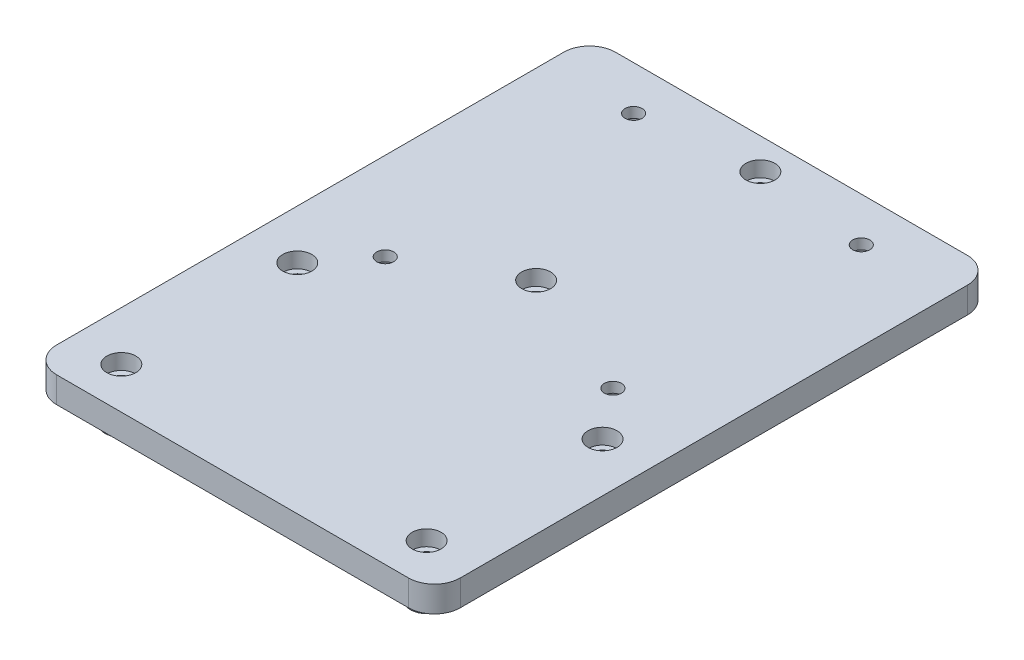
ISO-10303-21;
HEADER;
FILE_DESCRIPTION(('STEP AP214'),'2;1');
FILE_NAME('part.step','',(''),(''),'','','');
FILE_SCHEMA(('AUTOMOTIVE_DESIGN { 1 0 10303 214 1 1 1 1 }'));
ENDSEC;
DATA;
#1=APPLICATION_CONTEXT('core data for automotive mechanical design processes');
#2=APPLICATION_PROTOCOL_DEFINITION('international standard','automotive_design',2000,#1);
#3=PRODUCT_CONTEXT('',#1,'mechanical');
#4=PRODUCT('Part','Part','',(#3));
#5=PRODUCT_RELATED_PRODUCT_CATEGORY('part','',(#4));
#6=PRODUCT_DEFINITION_FORMATION('','',#4);
#7=PRODUCT_DEFINITION_CONTEXT('part definition',#1,'design');
#8=PRODUCT_DEFINITION('design','',#6,#7);
#9=PRODUCT_DEFINITION_SHAPE('','',#8);
#10=(LENGTH_UNIT() NAMED_UNIT(*) SI_UNIT(.MILLI.,.METRE.));
#11=(NAMED_UNIT(*) PLANE_ANGLE_UNIT() SI_UNIT($,.RADIAN.));
#12=(NAMED_UNIT(*) SI_UNIT($,.STERADIAN.) SOLID_ANGLE_UNIT());
#13=UNCERTAINTY_MEASURE_WITH_UNIT(LENGTH_MEASURE(1.E-05),#10,'distance_accuracy_value','');
#14=(GEOMETRIC_REPRESENTATION_CONTEXT(3) GLOBAL_UNCERTAINTY_ASSIGNED_CONTEXT((#13)) GLOBAL_UNIT_ASSIGNED_CONTEXT((#10,
#11,#12)) REPRESENTATION_CONTEXT('',''));
#15=CARTESIAN_POINT('',(0.,0.,0.));
#16=DIRECTION('',(0.,0.,1.));
#17=DIRECTION('',(1.,0.,0.));
#18=AXIS2_PLACEMENT_3D('',#15,#16,#17);
#19=CARTESIAN_POINT('',(0.,0.00200000000000027,-43.));
#20=DIRECTION('',(0.,-1.,0.));
#21=DIRECTION('',(0.,0.,-1.));
#22=AXIS2_PLACEMENT_3D('',#19,#20,#21);
#23=CYLINDRICAL_SURFACE('',#22,1.65);
#24=CARTESIAN_POINT('',(0.,-5.,-43.));
#25=DIRECTION('',(0.,-1.,0.));
#26=DIRECTION('',(0.,0.,-1.));
#27=AXIS2_PLACEMENT_3D('',#24,#25,#26);
#28=CIRCLE('',#27,1.65);
#29=CARTESIAN_POINT('',(0.,-5.,-44.65));
#30=VERTEX_POINT('',#29);
#31=EDGE_CURVE('E213',#30,#30,#28,.T.);
#32=ORIENTED_EDGE('',*,*,#31,.T.);
#33=EDGE_LOOP('',(#32));
#34=FACE_BOUND('',#33,.T.);
#35=CARTESIAN_POINT('',(0.,-3.,-43.));
#36=DIRECTION('',(0.,-1.,0.));
#37=DIRECTION('',(0.,0.,-1.));
#38=AXIS2_PLACEMENT_3D('',#35,#36,#37);
#39=CIRCLE('',#38,1.65);
#40=CARTESIAN_POINT('',(0.,-3.,-44.65));
#41=VERTEX_POINT('',#40);
#42=EDGE_CURVE('E655',#41,#41,#39,.F.);
#43=ORIENTED_EDGE('',*,*,#42,.T.);
#44=EDGE_LOOP('',(#43));
#45=FACE_BOUND('',#44,.T.);
#46=ADVANCED_FACE('F16',(#34,#45),#23,.F.);
#47=CARTESIAN_POINT('',(-3.48622970990632,0.00200000000000027,-3.15221207633018));
#48=DIRECTION('',(0.,-1.,0.));
#49=DIRECTION('',(0.,0.,-1.));
#50=AXIS2_PLACEMENT_3D('',#47,#48,#49);
#51=CYLINDRICAL_SURFACE('',#50,1.65);
#52=CARTESIAN_POINT('',(-3.48622970990632,-5.,-3.15221207633018));
#53=DIRECTION('',(0.,-1.,0.));
#54=DIRECTION('',(0.,0.,-1.));
#55=AXIS2_PLACEMENT_3D('',#52,#53,#54);
#56=CIRCLE('',#55,1.65);
#57=CARTESIAN_POINT('',(-3.48622970990632,-5.,-4.80221207633017));
#58=VERTEX_POINT('',#57);
#59=EDGE_CURVE('E220',#58,#58,#56,.T.);
#60=ORIENTED_EDGE('',*,*,#59,.T.);
#61=EDGE_LOOP('',(#60));
#62=FACE_BOUND('',#61,.T.);
#63=CARTESIAN_POINT('',(-3.48622970990632,-3.,-3.15221207633018));
#64=DIRECTION('',(0.,-1.,0.));
#65=DIRECTION('',(0.,0.,-1.));
#66=AXIS2_PLACEMENT_3D('',#63,#64,#65);
#67=CIRCLE('',#66,1.65);
#68=CARTESIAN_POINT('',(-3.48622970990632,-3.,-4.80221207633017));
#69=VERTEX_POINT('',#68);
#70=EDGE_CURVE('E274',#69,#69,#67,.F.);
#71=ORIENTED_EDGE('',*,*,#70,.T.);
#72=EDGE_LOOP('',(#71));
#73=FACE_BOUND('',#72,.T.);
#74=ADVANCED_FACE('F368',(#62,#73),#51,.F.);
#75=CARTESIAN_POINT('',(-29.5,-10.,17.));
#76=DIRECTION('',(0.,1.,0.));
#77=DIRECTION('',(0.,0.,1.));
#78=AXIS2_PLACEMENT_3D('',#75,#76,#77);
#79=CYLINDRICAL_SURFACE('',#78,1.65);
#80=CARTESIAN_POINT('',(-29.5,-10.,17.));
#81=DIRECTION('',(0.,-1.,0.));
#82=DIRECTION('',(0.,0.,-1.));
#83=AXIS2_PLACEMENT_3D('',#80,#81,#82);
#84=CIRCLE('',#83,1.65);
#85=CARTESIAN_POINT('',(-29.5,-10.,15.35));
#86=VERTEX_POINT('',#85);
#87=EDGE_CURVE('E320',#86,#86,#84,.T.);
#88=ORIENTED_EDGE('',*,*,#87,.T.);
#89=EDGE_LOOP('',(#88));
#90=FACE_BOUND('',#89,.T.);
#91=CARTESIAN_POINT('',(-29.5,-3.,17.));
#92=DIRECTION('',(0.,-1.,0.));
#93=DIRECTION('',(0.,0.,-1.));
#94=AXIS2_PLACEMENT_3D('',#91,#92,#93);
#95=CIRCLE('',#94,1.65);
#96=CARTESIAN_POINT('',(-29.5,-3.,15.35));
#97=VERTEX_POINT('',#96);
#98=EDGE_CURVE('E648',#97,#97,#95,.F.);
#99=ORIENTED_EDGE('',*,*,#98,.T.);
#100=EDGE_LOOP('',(#99));
#101=FACE_BOUND('',#100,.T.);
#102=ADVANCED_FACE('F374',(#90,#101),#79,.F.);
#103=CARTESIAN_POINT('',(-29.5,-10.,51.));
#104=DIRECTION('',(0.,1.,0.));
#105=DIRECTION('',(0.,0.,1.));
#106=AXIS2_PLACEMENT_3D('',#103,#104,#105);
#107=CYLINDRICAL_SURFACE('',#106,1.65);
#108=CARTESIAN_POINT('',(-29.5,-10.,51.));
#109=DIRECTION('',(0.,-1.,0.));
#110=DIRECTION('',(0.,0.,-1.));
#111=AXIS2_PLACEMENT_3D('',#108,#109,#110);
#112=CIRCLE('',#111,1.65);
#113=CARTESIAN_POINT('',(-29.5,-10.,49.35));
#114=VERTEX_POINT('',#113);
#115=EDGE_CURVE('E316',#114,#114,#112,.T.);
#116=ORIENTED_EDGE('',*,*,#115,.T.);
#117=EDGE_LOOP('',(#116));
#118=FACE_BOUND('',#117,.T.);
#119=CARTESIAN_POINT('',(-29.5,-3.,51.));
#120=DIRECTION('',(0.,-1.,0.));
#121=DIRECTION('',(0.,0.,-1.));
#122=AXIS2_PLACEMENT_3D('',#119,#120,#121);
#123=CIRCLE('',#122,1.65);
#124=CARTESIAN_POINT('',(-29.5,-3.,49.35));
#125=VERTEX_POINT('',#124);
#126=EDGE_CURVE('E641',#125,#125,#123,.T.);
#127=ORIENTED_EDGE('',*,*,#126,.F.);
#128=EDGE_LOOP('',(#127));
#129=FACE_BOUND('',#128,.T.);
#130=ADVANCED_FACE('F488',(#118,#129),#107,.F.);
#131=CARTESIAN_POINT('',(29.5,-10.,51.));
#132=DIRECTION('',(0.,1.,0.));
#133=DIRECTION('',(0.,0.,1.));
#134=AXIS2_PLACEMENT_3D('',#131,#132,#133);
#135=CYLINDRICAL_SURFACE('',#134,1.65);
#136=CARTESIAN_POINT('',(29.5,-10.,51.));
#137=DIRECTION('',(0.,-1.,0.));
#138=DIRECTION('',(0.,0.,-1.));
#139=AXIS2_PLACEMENT_3D('',#136,#137,#138);
#140=CIRCLE('',#139,1.65);
#141=CARTESIAN_POINT('',(29.5,-10.,49.35));
#142=VERTEX_POINT('',#141);
#143=EDGE_CURVE('E304',#142,#142,#140,.T.);
#144=ORIENTED_EDGE('',*,*,#143,.T.);
#145=EDGE_LOOP('',(#144));
#146=FACE_BOUND('',#145,.T.);
#147=CARTESIAN_POINT('',(29.5,-3.,51.));
#148=DIRECTION('',(0.,-1.,0.));
#149=DIRECTION('',(0.,0.,-1.));
#150=AXIS2_PLACEMENT_3D('',#147,#148,#149);
#151=CIRCLE('',#150,1.65);
#152=CARTESIAN_POINT('',(29.5,-3.,49.35));
#153=VERTEX_POINT('',#152);
#154=EDGE_CURVE('E634',#153,#153,#151,.T.);
#155=ORIENTED_EDGE('',*,*,#154,.F.);
#156=EDGE_LOOP('',(#155));
#157=FACE_BOUND('',#156,.T.);
#158=ADVANCED_FACE('F476',(#146,#157),#135,.F.);
#159=CARTESIAN_POINT('',(29.5,-10.,17.));
#160=DIRECTION('',(0.,1.,0.));
#161=DIRECTION('',(0.,0.,1.));
#162=AXIS2_PLACEMENT_3D('',#159,#160,#161);
#163=CYLINDRICAL_SURFACE('',#162,1.65);
#164=CARTESIAN_POINT('',(29.5,-10.,17.));
#165=DIRECTION('',(0.,-1.,0.));
#166=DIRECTION('',(0.,0.,-1.));
#167=AXIS2_PLACEMENT_3D('',#164,#165,#166);
#168=CIRCLE('',#167,1.65);
#169=CARTESIAN_POINT('',(29.5,-10.,15.35));
#170=VERTEX_POINT('',#169);
#171=EDGE_CURVE('E292',#170,#170,#168,.T.);
#172=ORIENTED_EDGE('',*,*,#171,.T.);
#173=EDGE_LOOP('',(#172));
#174=FACE_BOUND('',#173,.T.);
#175=CARTESIAN_POINT('',(29.5,-3.,17.));
#176=DIRECTION('',(0.,-1.,0.));
#177=DIRECTION('',(0.,0.,-1.));
#178=AXIS2_PLACEMENT_3D('',#175,#176,#177);
#179=CIRCLE('',#178,1.65);
#180=CARTESIAN_POINT('',(29.5,-3.,15.35));
#181=VERTEX_POINT('',#180);
#182=EDGE_CURVE('E627',#181,#181,#179,.T.);
#183=ORIENTED_EDGE('',*,*,#182,.F.);
#184=EDGE_LOOP('',(#183));
#185=FACE_BOUND('',#184,.T.);
#186=ADVANCED_FACE('F391',(#174,#185),#163,.F.);
#187=CARTESIAN_POINT('',(-22.,-5.,7.5));
#188=DIRECTION('',(0.,1.,0.));
#189=DIRECTION('',(0.,0.,1.));
#190=AXIS2_PLACEMENT_3D('',#187,#188,#189);
#191=CYLINDRICAL_SURFACE('',#190,1.65);
#192=CARTESIAN_POINT('',(-22.,0.,7.5));
#193=DIRECTION('',(0.,-1.,0.));
#194=DIRECTION('',(0.,0.,-1.));
#195=AXIS2_PLACEMENT_3D('',#192,#193,#194);
#196=CIRCLE('',#195,1.65);
#197=CARTESIAN_POINT('',(-22.,0.,5.85));
#198=VERTEX_POINT('',#197);
#199=EDGE_CURVE('E135',#198,#198,#196,.T.);
#200=ORIENTED_EDGE('',*,*,#199,.F.);
#201=EDGE_LOOP('',(#200));
#202=FACE_BOUND('',#201,.T.);
#203=CARTESIAN_POINT('',(-22.,-2.,7.5));
#204=DIRECTION('',(0.,-1.,0.));
#205=DIRECTION('',(0.,0.,-1.));
#206=AXIS2_PLACEMENT_3D('',#203,#204,#205);
#207=CIRCLE('',#206,1.65);
#208=CARTESIAN_POINT('',(-22.,-2.,5.85));
#209=VERTEX_POINT('',#208);
#210=EDGE_CURVE('E279',#209,#209,#207,.T.);
#211=ORIENTED_EDGE('',*,*,#210,.T.);
#212=EDGE_LOOP('',(#211));
#213=FACE_BOUND('',#212,.T.);
#214=ADVANCED_FACE('F249',(#202,#213),#191,.F.);
#215=CARTESIAN_POINT('',(-22.,-5.,-40.5));
#216=DIRECTION('',(0.,1.,0.));
#217=DIRECTION('',(0.,0.,1.));
#218=AXIS2_PLACEMENT_3D('',#215,#216,#217);
#219=CYLINDRICAL_SURFACE('',#218,1.65);
#220=CARTESIAN_POINT('',(-22.,0.,-40.5));
#221=DIRECTION('',(0.,-1.,0.));
#222=DIRECTION('',(0.,0.,-1.));
#223=AXIS2_PLACEMENT_3D('',#220,#221,#222);
#224=CIRCLE('',#223,1.65);
#225=CARTESIAN_POINT('',(-22.,0.,-42.15));
#226=VERTEX_POINT('',#225);
#227=EDGE_CURVE('E145',#226,#226,#224,.T.);
#228=ORIENTED_EDGE('',*,*,#227,.F.);
#229=EDGE_LOOP('',(#228));
#230=FACE_BOUND('',#229,.T.);
#231=CARTESIAN_POINT('',(-22.,-2.,-40.5));
#232=DIRECTION('',(0.,-1.,0.));
#233=DIRECTION('',(0.,0.,-1.));
#234=AXIS2_PLACEMENT_3D('',#231,#232,#233);
#235=CIRCLE('',#234,1.65);
#236=CARTESIAN_POINT('',(-22.,-2.,-42.15));
#237=VERTEX_POINT('',#236);
#238=EDGE_CURVE('E253',#237,#237,#235,.T.);
#239=ORIENTED_EDGE('',*,*,#238,.T.);
#240=EDGE_LOOP('',(#239));
#241=FACE_BOUND('',#240,.T.);
#242=ADVANCED_FACE('F245',(#230,#241),#219,.F.);
#243=CARTESIAN_POINT('',(22.,-5.,-40.5));
#244=DIRECTION('',(0.,1.,0.));
#245=DIRECTION('',(0.,0.,1.));
#246=AXIS2_PLACEMENT_3D('',#243,#244,#245);
#247=CYLINDRICAL_SURFACE('',#246,1.65);
#248=CARTESIAN_POINT('',(22.,0.,-40.5));
#249=DIRECTION('',(0.,-1.,0.));
#250=DIRECTION('',(0.,0.,-1.));
#251=AXIS2_PLACEMENT_3D('',#248,#249,#250);
#252=CIRCLE('',#251,1.65);
#253=CARTESIAN_POINT('',(22.,0.,-42.15));
#254=VERTEX_POINT('',#253);
#255=EDGE_CURVE('E235',#254,#254,#252,.T.);
#256=ORIENTED_EDGE('',*,*,#255,.F.);
#257=EDGE_LOOP('',(#256));
#258=FACE_BOUND('',#257,.T.);
#259=CARTESIAN_POINT('',(22.,-2.,-40.5));
#260=DIRECTION('',(0.,-1.,0.));
#261=DIRECTION('',(0.,0.,-1.));
#262=AXIS2_PLACEMENT_3D('',#259,#260,#261);
#263=CIRCLE('',#262,1.65);
#264=CARTESIAN_POINT('',(22.,-2.,-42.15));
#265=VERTEX_POINT('',#264);
#266=EDGE_CURVE('E775',#265,#265,#263,.T.);
#267=ORIENTED_EDGE('',*,*,#266,.T.);
#268=EDGE_LOOP('',(#267));
#269=FACE_BOUND('',#268,.T.);
#270=ADVANCED_FACE('F248',(#258,#269),#247,.F.);
#271=CARTESIAN_POINT('',(22.,-5.,7.5));
#272=DIRECTION('',(0.,1.,0.));
#273=DIRECTION('',(0.,0.,1.));
#274=AXIS2_PLACEMENT_3D('',#271,#272,#273);
#275=CYLINDRICAL_SURFACE('',#274,1.65);
#276=CARTESIAN_POINT('',(22.,0.,7.5));
#277=DIRECTION('',(0.,-1.,0.));
#278=DIRECTION('',(0.,0.,-1.));
#279=AXIS2_PLACEMENT_3D('',#276,#277,#278);
#280=CIRCLE('',#279,1.65);
#281=CARTESIAN_POINT('',(22.,0.,5.85));
#282=VERTEX_POINT('',#281);
#283=EDGE_CURVE('E226',#282,#282,#280,.T.);
#284=ORIENTED_EDGE('',*,*,#283,.F.);
#285=EDGE_LOOP('',(#284));
#286=FACE_BOUND('',#285,.T.);
#287=CARTESIAN_POINT('',(22.,-2.,7.5));
#288=DIRECTION('',(0.,-1.,0.));
#289=DIRECTION('',(0.,0.,-1.));
#290=AXIS2_PLACEMENT_3D('',#287,#288,#289);
#291=CIRCLE('',#290,1.65);
#292=CARTESIAN_POINT('',(22.,-2.,5.85));
#293=VERTEX_POINT('',#292);
#294=EDGE_CURVE('E765',#293,#293,#291,.T.);
#295=ORIENTED_EDGE('',*,*,#294,.T.);
#296=EDGE_LOOP('',(#295));
#297=FACE_BOUND('',#296,.T.);
#298=ADVANCED_FACE('F382',(#286,#297),#275,.F.);
#299=CARTESIAN_POINT('',(0.,0.,0.));
#300=DIRECTION('',(0.,-1.,0.));
#301=DIRECTION('',(1.,0.,0.));
#302=AXIS2_PLACEMENT_3D('',#299,#300,#301);
#303=PLANE('',#302);
#304=CARTESIAN_POINT('',(-29.5,0.,51.));
#305=DIRECTION('',(0.,1.,0.));
#306=DIRECTION('',(0.,0.,1.));
#307=AXIS2_PLACEMENT_3D('',#304,#305,#306);
#308=CIRCLE('',#307,2.8);
#309=CARTESIAN_POINT('',(-29.5,0.,53.8));
#310=VERTEX_POINT('',#309);
#311=EDGE_CURVE('E652',#310,#310,#308,.T.);
#312=ORIENTED_EDGE('',*,*,#311,.F.);
#313=EDGE_LOOP('',(#312));
#314=FACE_BOUND('',#313,.T.);
#315=CARTESIAN_POINT('',(29.5,0.,17.));
#316=DIRECTION('',(0.,1.,0.));
#317=DIRECTION('',(0.,0.,1.));
#318=AXIS2_PLACEMENT_3D('',#315,#316,#317);
#319=CIRCLE('',#318,2.8);
#320=CARTESIAN_POINT('',(29.5,0.,19.8));
#321=VERTEX_POINT('',#320);
#322=EDGE_CURVE('E645',#321,#321,#319,.T.);
#323=ORIENTED_EDGE('',*,*,#322,.F.);
#324=EDGE_LOOP('',(#323));
#325=FACE_BOUND('',#324,.T.);
#326=CARTESIAN_POINT('',(29.5,0.,51.));
#327=DIRECTION('',(0.,1.,0.));
#328=DIRECTION('',(0.,0.,1.));
#329=AXIS2_PLACEMENT_3D('',#326,#327,#328);
#330=CIRCLE('',#329,2.8);
#331=CARTESIAN_POINT('',(29.5,0.,53.8));
#332=VERTEX_POINT('',#331);
#333=EDGE_CURVE('E631',#332,#332,#330,.T.);
#334=ORIENTED_EDGE('',*,*,#333,.F.);
#335=EDGE_LOOP('',(#334));
#336=FACE_BOUND('',#335,.T.);
#337=CARTESIAN_POINT('',(0.,0.,-43.));
#338=DIRECTION('',(0.,1.,0.));
#339=DIRECTION('',(0.,0.,1.));
#340=AXIS2_PLACEMENT_3D('',#337,#338,#339);
#341=CIRCLE('',#340,2.8);
#342=CARTESIAN_POINT('',(0.,0.,-40.2));
#343=VERTEX_POINT('',#342);
#344=EDGE_CURVE('E638',#343,#343,#341,.T.);
#345=ORIENTED_EDGE('',*,*,#344,.F.);
#346=EDGE_LOOP('',(#345));
#347=FACE_BOUND('',#346,.T.);
#348=CARTESIAN_POINT('',(-29.5,0.,17.));
#349=DIRECTION('',(0.,1.,0.));
#350=DIRECTION('',(0.,0.,1.));
#351=AXIS2_PLACEMENT_3D('',#348,#349,#350);
#352=CIRCLE('',#351,2.8);
#353=CARTESIAN_POINT('',(-29.5,0.,19.8));
#354=VERTEX_POINT('',#353);
#355=EDGE_CURVE('E669',#354,#354,#352,.T.);
#356=ORIENTED_EDGE('',*,*,#355,.F.);
#357=EDGE_LOOP('',(#356));
#358=FACE_BOUND('',#357,.T.);
#359=CARTESIAN_POINT('',(-3.48622970990632,0.,-3.15221207633018));
#360=DIRECTION('',(0.,1.,0.));
#361=DIRECTION('',(0.,0.,1.));
#362=AXIS2_PLACEMENT_3D('',#359,#360,#361);
#363=CIRCLE('',#362,2.8);
#364=CARTESIAN_POINT('',(-3.48622970990632,0.,-0.352212076330175));
#365=VERTEX_POINT('',#364);
#366=EDGE_CURVE('E702',#365,#365,#363,.T.);
#367=ORIENTED_EDGE('',*,*,#366,.F.);
#368=EDGE_LOOP('',(#367));
#369=FACE_BOUND('',#368,.T.);
#370=DIRECTION('',(0.,0.,-1.));
#371=VECTOR('',#370,1.);
#372=CARTESIAN_POINT('',(-39.,0.,0.));
#373=LINE('',#372,#371);
#374=CARTESIAN_POINT('',(-39.,0.,54.));
#375=VERTEX_POINT('',#374);
#376=CARTESIAN_POINT('',(-39.,0.,-44.));
#377=VERTEX_POINT('',#376);
#378=EDGE_CURVE('E122',#375,#377,#373,.T.);
#379=ORIENTED_EDGE('',*,*,#378,.F.);
#380=CARTESIAN_POINT('',(-34.,0.,54.));
#381=DIRECTION('',(0.,-1.,0.));
#382=DIRECTION('',(0.,0.,-1.));
#383=AXIS2_PLACEMENT_3D('',#380,#381,#382);
#384=CIRCLE('',#383,5.);
#385=CARTESIAN_POINT('',(-34.,0.,59.));
#386=VERTEX_POINT('',#385);
#387=EDGE_CURVE('E104',#375,#386,#384,.F.);
#388=ORIENTED_EDGE('',*,*,#387,.T.);
#389=DIRECTION('',(1.,0.,0.));
#390=VECTOR('',#389,1.);
#391=CARTESIAN_POINT('',(0.,0.,59.));
#392=LINE('',#391,#390);
#393=CARTESIAN_POINT('',(34.,0.,59.));
#394=VERTEX_POINT('',#393);
#395=EDGE_CURVE('E206',#386,#394,#392,.T.);
#396=ORIENTED_EDGE('',*,*,#395,.T.);
#397=CARTESIAN_POINT('',(34.,0.,54.));
#398=DIRECTION('',(0.,-1.,0.));
#399=DIRECTION('',(0.,0.,-1.));
#400=AXIS2_PLACEMENT_3D('',#397,#398,#399);
#401=CIRCLE('',#400,5.);
#402=CARTESIAN_POINT('',(39.,0.,54.));
#403=VERTEX_POINT('',#402);
#404=EDGE_CURVE('E116',#394,#403,#401,.F.);
#405=ORIENTED_EDGE('',*,*,#404,.T.);
#406=DIRECTION('',(0.,0.,-1.));
#407=VECTOR('',#406,1.);
#408=CARTESIAN_POINT('',(39.,0.,0.));
#409=LINE('',#408,#407);
#410=CARTESIAN_POINT('',(39.,0.,-44.));
#411=VERTEX_POINT('',#410);
#412=EDGE_CURVE('E141',#403,#411,#409,.T.);
#413=ORIENTED_EDGE('',*,*,#412,.T.);
#414=CARTESIAN_POINT('',(34.,0.,-44.));
#415=DIRECTION('',(0.,-1.,0.));
#416=DIRECTION('',(0.,0.,-1.));
#417=AXIS2_PLACEMENT_3D('',#414,#415,#416);
#418=CIRCLE('',#417,5.);
#419=CARTESIAN_POINT('',(34.,0.,-49.));
#420=VERTEX_POINT('',#419);
#421=EDGE_CURVE('E126',#411,#420,#418,.F.);
#422=ORIENTED_EDGE('',*,*,#421,.T.);
#423=DIRECTION('',(1.,0.,0.));
#424=VECTOR('',#423,1.);
#425=CARTESIAN_POINT('',(0.,0.,-49.));
#426=LINE('',#425,#424);
#427=CARTESIAN_POINT('',(-34.,0.,-49.));
#428=VERTEX_POINT('',#427);
#429=EDGE_CURVE('E134',#428,#420,#426,.T.);
#430=ORIENTED_EDGE('',*,*,#429,.F.);
#431=CARTESIAN_POINT('',(-34.,0.,-44.));
#432=DIRECTION('',(0.,-1.,0.));
#433=DIRECTION('',(0.,0.,-1.));
#434=AXIS2_PLACEMENT_3D('',#431,#432,#433);
#435=CIRCLE('',#434,5.);
#436=EDGE_CURVE('E132',#428,#377,#435,.F.);
#437=ORIENTED_EDGE('',*,*,#436,.T.);
#438=EDGE_LOOP('',(#379,#388,#396,#405,#413,#422,#430,#437));
#439=FACE_BOUND('',#438,.T.);
#440=ORIENTED_EDGE('',*,*,#199,.T.);
#441=EDGE_LOOP('',(#440));
#442=FACE_BOUND('',#441,.T.);
#443=ORIENTED_EDGE('',*,*,#227,.T.);
#444=EDGE_LOOP('',(#443));
#445=FACE_BOUND('',#444,.T.);
#446=ORIENTED_EDGE('',*,*,#255,.T.);
#447=EDGE_LOOP('',(#446));
#448=FACE_BOUND('',#447,.T.);
#449=ORIENTED_EDGE('',*,*,#283,.T.);
#450=EDGE_LOOP('',(#449));
#451=FACE_BOUND('',#450,.T.);
#452=ADVANCED_FACE('F129',(#314,#325,#336,#347,#358,#369,#439,#442,#445,#448,#451),#303,.F.);
#453=CARTESIAN_POINT('',(-39.,-5.,0.));
#454=DIRECTION('',(1.,0.,0.));
#455=DIRECTION('',(0.,0.,-1.));
#456=AXIS2_PLACEMENT_3D('',#453,#454,#455);
#457=PLANE('',#456);
#458=DIRECTION('',(0.,0.,-1.));
#459=VECTOR('',#458,1.);
#460=CARTESIAN_POINT('',(-39.,-5.,0.));
#461=LINE('',#460,#459);
#462=CARTESIAN_POINT('',(-39.,-5.,54.));
#463=VERTEX_POINT('',#462);
#464=CARTESIAN_POINT('',(-39.,-5.,-44.));
#465=VERTEX_POINT('',#464);
#466=EDGE_CURVE('E124',#463,#465,#461,.T.);
#467=ORIENTED_EDGE('',*,*,#466,.F.);
#468=DIRECTION('',(0.,1.,0.));
#469=VECTOR('',#468,1.);
#470=CARTESIAN_POINT('',(-39.,0.,54.));
#471=LINE('',#470,#469);
#472=EDGE_CURVE('E108',#463,#375,#471,.T.);
#473=ORIENTED_EDGE('',*,*,#472,.T.);
#474=ORIENTED_EDGE('',*,*,#378,.T.);
#475=DIRECTION('',(0.,1.,0.));
#476=VECTOR('',#475,1.);
#477=CARTESIAN_POINT('',(-39.,-5.,-44.));
#478=LINE('',#477,#476);
#479=EDGE_CURVE('E127',#377,#465,#478,.F.);
#480=ORIENTED_EDGE('',*,*,#479,.T.);
#481=EDGE_LOOP('',(#467,#473,#474,#480));
#482=FACE_BOUND('',#481,.T.);
#483=ADVANCED_FACE('F121',(#482),#457,.F.);
#484=CARTESIAN_POINT('',(0.,-5.,-49.));
#485=DIRECTION('',(0.,0.,1.));
#486=DIRECTION('',(1.,0.,0.));
#487=AXIS2_PLACEMENT_3D('',#484,#485,#486);
#488=PLANE('',#487);
#489=DIRECTION('',(1.,0.,0.));
#490=VECTOR('',#489,1.);
#491=CARTESIAN_POINT('',(0.,-5.,-49.));
#492=LINE('',#491,#490);
#493=CARTESIAN_POINT('',(-34.,-5.,-49.));
#494=VERTEX_POINT('',#493);
#495=CARTESIAN_POINT('',(34.,-5.,-49.));
#496=VERTEX_POINT('',#495);
#497=EDGE_CURVE('E193',#494,#496,#492,.T.);
#498=ORIENTED_EDGE('',*,*,#497,.F.);
#499=DIRECTION('',(0.,1.,0.));
#500=VECTOR('',#499,1.);
#501=CARTESIAN_POINT('',(-34.,-5.,-49.));
#502=LINE('',#501,#500);
#503=EDGE_CURVE('E10',#494,#428,#502,.T.);
#504=ORIENTED_EDGE('',*,*,#503,.T.);
#505=ORIENTED_EDGE('',*,*,#429,.T.);
#506=DIRECTION('',(0.,1.,0.));
#507=VECTOR('',#506,1.);
#508=CARTESIAN_POINT('',(34.,-5.,-49.));
#509=LINE('',#508,#507);
#510=EDGE_CURVE('E25',#420,#496,#509,.F.);
#511=ORIENTED_EDGE('',*,*,#510,.T.);
#512=EDGE_LOOP('',(#498,#504,#505,#511));
#513=FACE_BOUND('',#512,.T.);
#514=ADVANCED_FACE('F356',(#513),#488,.F.);
#515=CARTESIAN_POINT('',(39.,-5.,0.));
#516=DIRECTION('',(1.,0.,0.));
#517=DIRECTION('',(0.,0.,-1.));
#518=AXIS2_PLACEMENT_3D('',#515,#516,#517);
#519=PLANE('',#518);
#520=ORIENTED_EDGE('',*,*,#412,.F.);
#521=DIRECTION('',(0.,1.,0.));
#522=VECTOR('',#521,1.);
#523=CARTESIAN_POINT('',(39.,-5.,54.));
#524=LINE('',#523,#522);
#525=CARTESIAN_POINT('',(39.,-5.,54.));
#526=VERTEX_POINT('',#525);
#527=EDGE_CURVE('E181',#403,#526,#524,.F.);
#528=ORIENTED_EDGE('',*,*,#527,.T.);
#529=DIRECTION('',(0.,0.,-1.));
#530=VECTOR('',#529,1.);
#531=CARTESIAN_POINT('',(39.,-5.,0.));
#532=LINE('',#531,#530);
#533=CARTESIAN_POINT('',(39.,-5.,-44.));
#534=VERTEX_POINT('',#533);
#535=EDGE_CURVE('E195',#526,#534,#532,.T.);
#536=ORIENTED_EDGE('',*,*,#535,.T.);
#537=DIRECTION('',(0.,1.,0.));
#538=VECTOR('',#537,1.);
#539=CARTESIAN_POINT('',(39.,0.,-44.));
#540=LINE('',#539,#538);
#541=EDGE_CURVE('E177',#534,#411,#540,.T.);
#542=ORIENTED_EDGE('',*,*,#541,.T.);
#543=EDGE_LOOP('',(#520,#528,#536,#542));
#544=FACE_BOUND('',#543,.T.);
#545=ADVANCED_FACE('F340',(#544),#519,.T.);
#546=CARTESIAN_POINT('',(0.,-5.,0.));
#547=DIRECTION('',(0.,-1.,0.));
#548=DIRECTION('',(1.,0.,0.));
#549=AXIS2_PLACEMENT_3D('',#546,#547,#548);
#550=PLANE('',#549);
#551=CARTESIAN_POINT('',(-22.,-5.,-40.5));
#552=DIRECTION('',(0.,-1.,0.));
#553=DIRECTION('',(0.,0.,-1.));
#554=AXIS2_PLACEMENT_3D('',#551,#552,#553);
#555=CIRCLE('',#554,2.8);
#556=CARTESIAN_POINT('',(-22.,-5.,-43.3));
#557=VERTEX_POINT('',#556);
#558=EDGE_CURVE('E268',#557,#557,#555,.T.);
#559=ORIENTED_EDGE('',*,*,#558,.F.);
#560=EDGE_LOOP('',(#559));
#561=FACE_BOUND('',#560,.T.);
#562=CARTESIAN_POINT('',(22.,-5.,-40.5));
#563=DIRECTION('',(0.,-1.,0.));
#564=DIRECTION('',(0.,0.,-1.));
#565=AXIS2_PLACEMENT_3D('',#562,#563,#564);
#566=CIRCLE('',#565,2.8);
#567=CARTESIAN_POINT('',(22.,-5.,-43.3));
#568=VERTEX_POINT('',#567);
#569=EDGE_CURVE('E256',#568,#568,#566,.T.);
#570=ORIENTED_EDGE('',*,*,#569,.F.);
#571=EDGE_LOOP('',(#570));
#572=FACE_BOUND('',#571,.T.);
#573=CARTESIAN_POINT('',(22.,-5.,7.5));
#574=DIRECTION('',(0.,-1.,0.));
#575=DIRECTION('',(0.,0.,-1.));
#576=AXIS2_PLACEMENT_3D('',#573,#574,#575);
#577=CIRCLE('',#576,2.8);
#578=CARTESIAN_POINT('',(22.,-5.,4.7));
#579=VERTEX_POINT('',#578);
#580=EDGE_CURVE('E768',#579,#579,#577,.T.);
#581=ORIENTED_EDGE('',*,*,#580,.F.);
#582=EDGE_LOOP('',(#581));
#583=FACE_BOUND('',#582,.T.);
#584=CARTESIAN_POINT('',(-22.,-5.,7.5));
#585=DIRECTION('',(0.,-1.,0.));
#586=DIRECTION('',(0.,0.,-1.));
#587=AXIS2_PLACEMENT_3D('',#584,#585,#586);
#588=CIRCLE('',#587,2.8);
#589=CARTESIAN_POINT('',(-22.,-5.,4.7));
#590=VERTEX_POINT('',#589);
#591=EDGE_CURVE('E280',#590,#590,#588,.T.);
#592=ORIENTED_EDGE('',*,*,#591,.F.);
#593=EDGE_LOOP('',(#592));
#594=FACE_BOUND('',#593,.T.);
#595=CARTESIAN_POINT('',(29.5,-5.,17.));
#596=DIRECTION('',(0.,-1.,0.));
#597=DIRECTION('',(0.,0.,-1.));
#598=AXIS2_PLACEMENT_3D('',#595,#596,#597);
#599=CIRCLE('',#598,3.15);
#600=CARTESIAN_POINT('',(29.5,-5.,13.85));
#601=VERTEX_POINT('',#600);
#602=EDGE_CURVE('E283',#601,#601,#599,.T.);
#603=ORIENTED_EDGE('',*,*,#602,.F.);
#604=EDGE_LOOP('',(#603));
#605=FACE_BOUND('',#604,.T.);
#606=CARTESIAN_POINT('',(29.5,-5.,51.));
#607=DIRECTION('',(0.,-1.,0.));
#608=DIRECTION('',(0.,0.,-1.));
#609=AXIS2_PLACEMENT_3D('',#606,#607,#608);
#610=CIRCLE('',#609,3.15);
#611=CARTESIAN_POINT('',(29.5,-5.,47.85));
#612=VERTEX_POINT('',#611);
#613=EDGE_CURVE('E296',#612,#612,#610,.T.);
#614=ORIENTED_EDGE('',*,*,#613,.F.);
#615=EDGE_LOOP('',(#614));
#616=FACE_BOUND('',#615,.T.);
#617=CARTESIAN_POINT('',(-29.5,-5.,51.));
#618=DIRECTION('',(0.,-1.,0.));
#619=DIRECTION('',(0.,0.,-1.));
#620=AXIS2_PLACEMENT_3D('',#617,#618,#619);
#621=CIRCLE('',#620,3.15);
#622=CARTESIAN_POINT('',(-29.5,-5.,47.85));
#623=VERTEX_POINT('',#622);
#624=EDGE_CURVE('E308',#623,#623,#621,.T.);
#625=ORIENTED_EDGE('',*,*,#624,.F.);
#626=EDGE_LOOP('',(#625));
#627=FACE_BOUND('',#626,.T.);
#628=CARTESIAN_POINT('',(-29.5,-5.,17.));
#629=DIRECTION('',(0.,-1.,0.));
#630=DIRECTION('',(0.,0.,-1.));
#631=AXIS2_PLACEMENT_3D('',#628,#629,#630);
#632=CIRCLE('',#631,3.15);
#633=CARTESIAN_POINT('',(-29.5,-5.,13.85));
#634=VERTEX_POINT('',#633);
#635=EDGE_CURVE('E153',#634,#634,#632,.T.);
#636=ORIENTED_EDGE('',*,*,#635,.F.);
#637=EDGE_LOOP('',(#636));
#638=FACE_BOUND('',#637,.T.);
#639=ORIENTED_EDGE('',*,*,#59,.F.);
#640=EDGE_LOOP('',(#639));
#641=FACE_BOUND('',#640,.T.);
#642=ORIENTED_EDGE('',*,*,#31,.F.);
#643=EDGE_LOOP('',(#642));
#644=FACE_BOUND('',#643,.T.);
#645=DIRECTION('',(1.,0.,0.));
#646=VECTOR('',#645,1.);
#647=CARTESIAN_POINT('',(0.,-5.,59.));
#648=LINE('',#647,#646);
#649=CARTESIAN_POINT('',(-34.,-5.,59.));
#650=VERTEX_POINT('',#649);
#651=CARTESIAN_POINT('',(34.,-5.,59.));
#652=VERTEX_POINT('',#651);
#653=EDGE_CURVE('E208',#650,#652,#648,.T.);
#654=ORIENTED_EDGE('',*,*,#653,.F.);
#655=CARTESIAN_POINT('',(-34.,-5.,54.));
#656=DIRECTION('',(0.,-1.,0.));
#657=DIRECTION('',(0.,0.,-1.));
#658=AXIS2_PLACEMENT_3D('',#655,#656,#657);
#659=CIRCLE('',#658,5.);
#660=EDGE_CURVE('E174',#650,#463,#659,.T.);
#661=ORIENTED_EDGE('',*,*,#660,.T.);
#662=ORIENTED_EDGE('',*,*,#466,.T.);
#663=CARTESIAN_POINT('',(-34.,-5.,-44.));
#664=DIRECTION('',(0.,-1.,0.));
#665=DIRECTION('',(0.,0.,-1.));
#666=AXIS2_PLACEMENT_3D('',#663,#664,#665);
#667=CIRCLE('',#666,5.);
#668=EDGE_CURVE('E47',#465,#494,#667,.T.);
#669=ORIENTED_EDGE('',*,*,#668,.T.);
#670=ORIENTED_EDGE('',*,*,#497,.T.);
#671=CARTESIAN_POINT('',(34.,-5.,-44.));
#672=DIRECTION('',(0.,-1.,0.));
#673=DIRECTION('',(0.,0.,-1.));
#674=AXIS2_PLACEMENT_3D('',#671,#672,#673);
#675=CIRCLE('',#674,5.);
#676=EDGE_CURVE('E166',#496,#534,#675,.T.);
#677=ORIENTED_EDGE('',*,*,#676,.T.);
#678=ORIENTED_EDGE('',*,*,#535,.F.);
#679=CARTESIAN_POINT('',(34.,-5.,54.));
#680=DIRECTION('',(0.,-1.,0.));
#681=DIRECTION('',(0.,0.,-1.));
#682=AXIS2_PLACEMENT_3D('',#679,#680,#681);
#683=CIRCLE('',#682,5.);
#684=EDGE_CURVE('E171',#526,#652,#683,.T.);
#685=ORIENTED_EDGE('',*,*,#684,.T.);
#686=EDGE_LOOP('',(#654,#661,#662,#669,#670,#677,#678,#685));
#687=FACE_BOUND('',#686,.T.);
#688=ADVANCED_FACE('F336',(#561,#572,#583,#594,#605,#616,#627,#638,#641,#644,#687),#550,.T.);
#689=CARTESIAN_POINT('',(0.,-5.,59.));
#690=DIRECTION('',(0.,0.,1.));
#691=DIRECTION('',(1.,0.,0.));
#692=AXIS2_PLACEMENT_3D('',#689,#690,#691);
#693=PLANE('',#692);
#694=ORIENTED_EDGE('',*,*,#395,.F.);
#695=DIRECTION('',(0.,1.,0.));
#696=VECTOR('',#695,1.);
#697=CARTESIAN_POINT('',(-34.,-5.,59.));
#698=LINE('',#697,#696);
#699=EDGE_CURVE('E109',#386,#650,#698,.F.);
#700=ORIENTED_EDGE('',*,*,#699,.T.);
#701=ORIENTED_EDGE('',*,*,#653,.T.);
#702=DIRECTION('',(0.,1.,0.));
#703=VECTOR('',#702,1.);
#704=CARTESIAN_POINT('',(34.,-5.,59.));
#705=LINE('',#704,#703);
#706=EDGE_CURVE('E115',#652,#394,#705,.T.);
#707=ORIENTED_EDGE('',*,*,#706,.T.);
#708=EDGE_LOOP('',(#694,#700,#701,#707));
#709=FACE_BOUND('',#708,.T.);
#710=ADVANCED_FACE('F339',(#709),#693,.T.);
#711=CARTESIAN_POINT('',(-29.5,-10.,17.));
#712=DIRECTION('',(0.,1.,0.));
#713=DIRECTION('',(0.,0.,1.));
#714=AXIS2_PLACEMENT_3D('',#711,#712,#713);
#715=CYLINDRICAL_SURFACE('',#714,3.15);
#716=CARTESIAN_POINT('',(-29.5,-10.,17.));
#717=DIRECTION('',(0.,-1.,0.));
#718=DIRECTION('',(0.,0.,-1.));
#719=AXIS2_PLACEMENT_3D('',#716,#717,#718);
#720=CIRCLE('',#719,3.15);
#721=CARTESIAN_POINT('',(-29.5,-10.,13.85));
#722=VERTEX_POINT('',#721);
#723=EDGE_CURVE('E209',#722,#722,#720,.T.);
#724=ORIENTED_EDGE('',*,*,#723,.F.);
#725=EDGE_LOOP('',(#724));
#726=FACE_BOUND('',#725,.T.);
#727=ORIENTED_EDGE('',*,*,#635,.T.);
#728=EDGE_LOOP('',(#727));
#729=FACE_BOUND('',#728,.T.);
#730=ADVANCED_FACE('F334',(#726,#729),#715,.T.);
#731=CARTESIAN_POINT('',(0.,-10.,5.));
#732=DIRECTION('',(0.,-1.,0.));
#733=DIRECTION('',(1.,0.,0.));
#734=AXIS2_PLACEMENT_3D('',#731,#732,#733);
#735=PLANE('',#734);
#736=ORIENTED_EDGE('',*,*,#87,.F.);
#737=EDGE_LOOP('',(#736));
#738=FACE_BOUND('',#737,.T.);
#739=ORIENTED_EDGE('',*,*,#723,.T.);
#740=EDGE_LOOP('',(#739));
#741=FACE_BOUND('',#740,.T.);
#742=ADVANCED_FACE('F503',(#738,#741),#735,.T.);
#743=CARTESIAN_POINT('',(-29.5,-10.,51.));
#744=DIRECTION('',(0.,1.,0.));
#745=DIRECTION('',(0.,0.,1.));
#746=AXIS2_PLACEMENT_3D('',#743,#744,#745);
#747=CYLINDRICAL_SURFACE('',#746,3.15);
#748=CARTESIAN_POINT('',(-29.5,-10.,51.));
#749=DIRECTION('',(0.,-1.,0.));
#750=DIRECTION('',(0.,0.,-1.));
#751=AXIS2_PLACEMENT_3D('',#748,#749,#750);
#752=CIRCLE('',#751,3.15);
#753=CARTESIAN_POINT('',(-29.5,-10.,47.85));
#754=VERTEX_POINT('',#753);
#755=EDGE_CURVE('E312',#754,#754,#752,.T.);
#756=ORIENTED_EDGE('',*,*,#755,.F.);
#757=EDGE_LOOP('',(#756));
#758=FACE_BOUND('',#757,.T.);
#759=ORIENTED_EDGE('',*,*,#624,.T.);
#760=EDGE_LOOP('',(#759));
#761=FACE_BOUND('',#760,.T.);
#762=ADVANCED_FACE('F496',(#758,#761),#747,.T.);
#763=CARTESIAN_POINT('',(0.,-10.,5.));
#764=DIRECTION('',(0.,-1.,0.));
#765=DIRECTION('',(1.,0.,0.));
#766=AXIS2_PLACEMENT_3D('',#763,#764,#765);
#767=PLANE('',#766);
#768=ORIENTED_EDGE('',*,*,#115,.F.);
#769=EDGE_LOOP('',(#768));
#770=FACE_BOUND('',#769,.T.);
#771=ORIENTED_EDGE('',*,*,#755,.T.);
#772=EDGE_LOOP('',(#771));
#773=FACE_BOUND('',#772,.T.);
#774=ADVANCED_FACE('F492',(#770,#773),#767,.T.);
#775=CARTESIAN_POINT('',(29.5,-10.,51.));
#776=DIRECTION('',(0.,1.,0.));
#777=DIRECTION('',(0.,0.,1.));
#778=AXIS2_PLACEMENT_3D('',#775,#776,#777);
#779=CYLINDRICAL_SURFACE('',#778,3.15);
#780=CARTESIAN_POINT('',(29.5,-10.,51.));
#781=DIRECTION('',(0.,-1.,0.));
#782=DIRECTION('',(0.,0.,-1.));
#783=AXIS2_PLACEMENT_3D('',#780,#781,#782);
#784=CIRCLE('',#783,3.15);
#785=CARTESIAN_POINT('',(29.5,-10.,47.85));
#786=VERTEX_POINT('',#785);
#787=EDGE_CURVE('E300',#786,#786,#784,.T.);
#788=ORIENTED_EDGE('',*,*,#787,.F.);
#789=EDGE_LOOP('',(#788));
#790=FACE_BOUND('',#789,.T.);
#791=ORIENTED_EDGE('',*,*,#613,.T.);
#792=EDGE_LOOP('',(#791));
#793=FACE_BOUND('',#792,.T.);
#794=ADVANCED_FACE('F484',(#790,#793),#779,.T.);
#795=CARTESIAN_POINT('',(0.,-10.,5.));
#796=DIRECTION('',(0.,-1.,0.));
#797=DIRECTION('',(1.,0.,0.));
#798=AXIS2_PLACEMENT_3D('',#795,#796,#797);
#799=PLANE('',#798);
#800=ORIENTED_EDGE('',*,*,#143,.F.);
#801=EDGE_LOOP('',(#800));
#802=FACE_BOUND('',#801,.T.);
#803=ORIENTED_EDGE('',*,*,#787,.T.);
#804=EDGE_LOOP('',(#803));
#805=FACE_BOUND('',#804,.T.);
#806=ADVANCED_FACE('F480',(#802,#805),#799,.T.);
#807=CARTESIAN_POINT('',(29.5,-10.,17.));
#808=DIRECTION('',(0.,1.,0.));
#809=DIRECTION('',(0.,0.,1.));
#810=AXIS2_PLACEMENT_3D('',#807,#808,#809);
#811=CYLINDRICAL_SURFACE('',#810,3.15);
#812=CARTESIAN_POINT('',(29.5,-10.,17.));
#813=DIRECTION('',(0.,-1.,0.));
#814=DIRECTION('',(0.,0.,-1.));
#815=AXIS2_PLACEMENT_3D('',#812,#813,#814);
#816=CIRCLE('',#815,3.15);
#817=CARTESIAN_POINT('',(29.5,-10.,13.85));
#818=VERTEX_POINT('',#817);
#819=EDGE_CURVE('E288',#818,#818,#816,.T.);
#820=ORIENTED_EDGE('',*,*,#819,.F.);
#821=EDGE_LOOP('',(#820));
#822=FACE_BOUND('',#821,.T.);
#823=ORIENTED_EDGE('',*,*,#602,.T.);
#824=EDGE_LOOP('',(#823));
#825=FACE_BOUND('',#824,.T.);
#826=ADVANCED_FACE('F472',(#822,#825),#811,.T.);
#827=CARTESIAN_POINT('',(0.,-10.,5.));
#828=DIRECTION('',(0.,-1.,0.));
#829=DIRECTION('',(1.,0.,0.));
#830=AXIS2_PLACEMENT_3D('',#827,#828,#829);
#831=PLANE('',#830);
#832=ORIENTED_EDGE('',*,*,#171,.F.);
#833=EDGE_LOOP('',(#832));
#834=FACE_BOUND('',#833,.T.);
#835=ORIENTED_EDGE('',*,*,#819,.T.);
#836=EDGE_LOOP('',(#835));
#837=FACE_BOUND('',#836,.T.);
#838=ADVANCED_FACE('F468',(#834,#837),#831,.T.);
#839=CARTESIAN_POINT('',(-22.,-2.,7.5));
#840=DIRECTION('',(0.,-1.,0.));
#841=DIRECTION('',(0.,0.,-1.));
#842=AXIS2_PLACEMENT_3D('',#839,#840,#841);
#843=CYLINDRICAL_SURFACE('',#842,2.8);
#844=CARTESIAN_POINT('',(-22.,-2.,7.5));
#845=DIRECTION('',(0.,-1.,0.));
#846=DIRECTION('',(0.,0.,-1.));
#847=AXIS2_PLACEMENT_3D('',#844,#845,#846);
#848=CIRCLE('',#847,2.8);
#849=CARTESIAN_POINT('',(-22.,-2.,4.7));
#850=VERTEX_POINT('',#849);
#851=EDGE_CURVE('E275',#850,#850,#848,.T.);
#852=ORIENTED_EDGE('',*,*,#851,.F.);
#853=EDGE_LOOP('',(#852));
#854=FACE_BOUND('',#853,.T.);
#855=ORIENTED_EDGE('',*,*,#591,.T.);
#856=EDGE_LOOP('',(#855));
#857=FACE_BOUND('',#856,.T.);
#858=ADVANCED_FACE('F464',(#854,#857),#843,.F.);
#859=CARTESIAN_POINT('',(0.,-2.,5.));
#860=DIRECTION('',(0.,-1.,0.));
#861=DIRECTION('',(1.,0.,0.));
#862=AXIS2_PLACEMENT_3D('',#859,#860,#861);
#863=PLANE('',#862);
#864=ORIENTED_EDGE('',*,*,#210,.F.);
#865=EDGE_LOOP('',(#864));
#866=FACE_BOUND('',#865,.T.);
#867=ORIENTED_EDGE('',*,*,#851,.T.);
#868=EDGE_LOOP('',(#867));
#869=FACE_BOUND('',#868,.T.);
#870=ADVANCED_FACE('F445',(#866,#869),#863,.T.);
#871=CARTESIAN_POINT('',(22.,-2.,7.5));
#872=DIRECTION('',(0.,-1.,0.));
#873=DIRECTION('',(0.,0.,-1.));
#874=AXIS2_PLACEMENT_3D('',#871,#872,#873);
#875=CYLINDRICAL_SURFACE('',#874,2.8);
#876=CARTESIAN_POINT('',(22.,-2.,7.5));
#877=DIRECTION('',(0.,-1.,0.));
#878=DIRECTION('',(0.,0.,-1.));
#879=AXIS2_PLACEMENT_3D('',#876,#877,#878);
#880=CIRCLE('',#879,2.8);
#881=CARTESIAN_POINT('',(22.,-2.,4.7));
#882=VERTEX_POINT('',#881);
#883=EDGE_CURVE('E287',#882,#882,#880,.T.);
#884=ORIENTED_EDGE('',*,*,#883,.F.);
#885=EDGE_LOOP('',(#884));
#886=FACE_BOUND('',#885,.T.);
#887=ORIENTED_EDGE('',*,*,#580,.T.);
#888=EDGE_LOOP('',(#887));
#889=FACE_BOUND('',#888,.T.);
#890=ADVANCED_FACE('F441',(#886,#889),#875,.F.);
#891=CARTESIAN_POINT('',(0.,-2.,5.));
#892=DIRECTION('',(0.,-1.,0.));
#893=DIRECTION('',(1.,0.,0.));
#894=AXIS2_PLACEMENT_3D('',#891,#892,#893);
#895=PLANE('',#894);
#896=ORIENTED_EDGE('',*,*,#294,.F.);
#897=EDGE_LOOP('',(#896));
#898=FACE_BOUND('',#897,.T.);
#899=ORIENTED_EDGE('',*,*,#883,.T.);
#900=EDGE_LOOP('',(#899));
#901=FACE_BOUND('',#900,.T.);
#902=ADVANCED_FACE('F437',(#898,#901),#895,.T.);
#903=CARTESIAN_POINT('',(22.,-2.,-40.5));
#904=DIRECTION('',(0.,-1.,0.));
#905=DIRECTION('',(0.,0.,-1.));
#906=AXIS2_PLACEMENT_3D('',#903,#904,#905);
#907=CYLINDRICAL_SURFACE('',#906,2.8);
#908=CARTESIAN_POINT('',(22.,-2.,-40.5));
#909=DIRECTION('',(0.,-1.,0.));
#910=DIRECTION('',(0.,0.,-1.));
#911=AXIS2_PLACEMENT_3D('',#908,#909,#910);
#912=CIRCLE('',#911,2.8);
#913=CARTESIAN_POINT('',(22.,-2.,-43.3));
#914=VERTEX_POINT('',#913);
#915=EDGE_CURVE('E264',#914,#914,#912,.T.);
#916=ORIENTED_EDGE('',*,*,#915,.F.);
#917=EDGE_LOOP('',(#916));
#918=FACE_BOUND('',#917,.T.);
#919=ORIENTED_EDGE('',*,*,#569,.T.);
#920=EDGE_LOOP('',(#919));
#921=FACE_BOUND('',#920,.T.);
#922=ADVANCED_FACE('F440',(#918,#921),#907,.F.);
#923=CARTESIAN_POINT('',(0.,-2.,5.));
#924=DIRECTION('',(0.,-1.,0.));
#925=DIRECTION('',(1.,0.,0.));
#926=AXIS2_PLACEMENT_3D('',#923,#924,#925);
#927=PLANE('',#926);
#928=ORIENTED_EDGE('',*,*,#266,.F.);
#929=EDGE_LOOP('',(#928));
#930=FACE_BOUND('',#929,.T.);
#931=ORIENTED_EDGE('',*,*,#915,.T.);
#932=EDGE_LOOP('',(#931));
#933=FACE_BOUND('',#932,.T.);
#934=ADVANCED_FACE('F447',(#930,#933),#927,.T.);
#935=CARTESIAN_POINT('',(-22.,-2.,-40.5));
#936=DIRECTION('',(0.,-1.,0.));
#937=DIRECTION('',(0.,0.,-1.));
#938=AXIS2_PLACEMENT_3D('',#935,#936,#937);
#939=CYLINDRICAL_SURFACE('',#938,2.8);
#940=CARTESIAN_POINT('',(-22.,-2.,-40.5));
#941=DIRECTION('',(0.,-1.,0.));
#942=DIRECTION('',(0.,0.,-1.));
#943=AXIS2_PLACEMENT_3D('',#940,#941,#942);
#944=CIRCLE('',#943,2.8);
#945=CARTESIAN_POINT('',(-22.,-2.,-43.3));
#946=VERTEX_POINT('',#945);
#947=EDGE_CURVE('E257',#946,#946,#944,.T.);
#948=ORIENTED_EDGE('',*,*,#947,.F.);
#949=EDGE_LOOP('',(#948));
#950=FACE_BOUND('',#949,.T.);
#951=ORIENTED_EDGE('',*,*,#558,.T.);
#952=EDGE_LOOP('',(#951));
#953=FACE_BOUND('',#952,.T.);
#954=ADVANCED_FACE('F450',(#950,#953),#939,.F.);
#955=CARTESIAN_POINT('',(0.,-2.,5.));
#956=DIRECTION('',(0.,-1.,0.));
#957=DIRECTION('',(1.,0.,0.));
#958=AXIS2_PLACEMENT_3D('',#955,#956,#957);
#959=PLANE('',#958);
#960=ORIENTED_EDGE('',*,*,#238,.F.);
#961=EDGE_LOOP('',(#960));
#962=FACE_BOUND('',#961,.T.);
#963=ORIENTED_EDGE('',*,*,#947,.T.);
#964=EDGE_LOOP('',(#963));
#965=FACE_BOUND('',#964,.T.);
#966=ADVANCED_FACE('F455',(#962,#965),#959,.T.);
#967=CARTESIAN_POINT('',(29.5,-3.,17.));
#968=DIRECTION('',(0.,1.,0.));
#969=DIRECTION('',(0.,0.,1.));
#970=AXIS2_PLACEMENT_3D('',#967,#968,#969);
#971=CYLINDRICAL_SURFACE('',#970,2.8);
#972=CARTESIAN_POINT('',(29.5,-3.,17.));
#973=DIRECTION('',(0.,1.,0.));
#974=DIRECTION('',(0.,0.,1.));
#975=AXIS2_PLACEMENT_3D('',#972,#973,#974);
#976=CIRCLE('',#975,2.8);
#977=CARTESIAN_POINT('',(29.5,-3.,19.8));
#978=VERTEX_POINT('',#977);
#979=EDGE_CURVE('E632',#978,#978,#976,.T.);
#980=ORIENTED_EDGE('',*,*,#979,.F.);
#981=EDGE_LOOP('',(#980));
#982=FACE_BOUND('',#981,.T.);
#983=ORIENTED_EDGE('',*,*,#322,.T.);
#984=EDGE_LOOP('',(#983));
#985=FACE_BOUND('',#984,.T.);
#986=ADVANCED_FACE('F458',(#982,#985),#971,.F.);
#987=CARTESIAN_POINT('',(0.,-3.,5.));
#988=DIRECTION('',(0.,1.,0.));
#989=DIRECTION('',(-1.,0.,0.));
#990=AXIS2_PLACEMENT_3D('',#987,#988,#989);
#991=PLANE('',#990);
#992=ORIENTED_EDGE('',*,*,#182,.T.);
#993=EDGE_LOOP('',(#992));
#994=FACE_BOUND('',#993,.T.);
#995=ORIENTED_EDGE('',*,*,#979,.T.);
#996=EDGE_LOOP('',(#995));
#997=FACE_BOUND('',#996,.T.);
#998=ADVANCED_FACE('F427',(#994,#997),#991,.T.);
#999=CARTESIAN_POINT('',(29.5,-3.,51.));
#1000=DIRECTION('',(0.,1.,0.));
#1001=DIRECTION('',(0.,0.,1.));
#1002=AXIS2_PLACEMENT_3D('',#999,#1000,#1001);
#1003=CYLINDRICAL_SURFACE('',#1002,2.8);
#1004=CARTESIAN_POINT('',(29.5,-3.,51.));
#1005=DIRECTION('',(0.,1.,0.));
#1006=DIRECTION('',(0.,0.,1.));
#1007=AXIS2_PLACEMENT_3D('',#1004,#1005,#1006);
#1008=CIRCLE('',#1007,2.8);
#1009=CARTESIAN_POINT('',(29.5,-3.,53.8));
#1010=VERTEX_POINT('',#1009);
#1011=EDGE_CURVE('E639',#1010,#1010,#1008,.T.);
#1012=ORIENTED_EDGE('',*,*,#1011,.F.);
#1013=EDGE_LOOP('',(#1012));
#1014=FACE_BOUND('',#1013,.T.);
#1015=ORIENTED_EDGE('',*,*,#333,.T.);
#1016=EDGE_LOOP('',(#1015));
#1017=FACE_BOUND('',#1016,.T.);
#1018=ADVANCED_FACE('F423',(#1014,#1017),#1003,.F.);
#1019=CARTESIAN_POINT('',(0.,-3.,5.));
#1020=DIRECTION('',(0.,1.,0.));
#1021=DIRECTION('',(-1.,0.,0.));
#1022=AXIS2_PLACEMENT_3D('',#1019,#1020,#1021);
#1023=PLANE('',#1022);
#1024=ORIENTED_EDGE('',*,*,#154,.T.);
#1025=EDGE_LOOP('',(#1024));
#1026=FACE_BOUND('',#1025,.T.);
#1027=ORIENTED_EDGE('',*,*,#1011,.T.);
#1028=EDGE_LOOP('',(#1027));
#1029=FACE_BOUND('',#1028,.T.);
#1030=ADVANCED_FACE('F420',(#1026,#1029),#1023,.T.);
#1031=CARTESIAN_POINT('',(-29.5,-3.,51.));
#1032=DIRECTION('',(0.,1.,0.));
#1033=DIRECTION('',(0.,0.,1.));
#1034=AXIS2_PLACEMENT_3D('',#1031,#1032,#1033);
#1035=CYLINDRICAL_SURFACE('',#1034,2.8);
#1036=CARTESIAN_POINT('',(-29.5,-3.,51.));
#1037=DIRECTION('',(0.,1.,0.));
#1038=DIRECTION('',(0.,0.,1.));
#1039=AXIS2_PLACEMENT_3D('',#1036,#1037,#1038);
#1040=CIRCLE('',#1039,2.8);
#1041=CARTESIAN_POINT('',(-29.5,-3.,53.8));
#1042=VERTEX_POINT('',#1041);
#1043=EDGE_CURVE('E646',#1042,#1042,#1040,.T.);
#1044=ORIENTED_EDGE('',*,*,#1043,.F.);
#1045=EDGE_LOOP('',(#1044));
#1046=FACE_BOUND('',#1045,.T.);
#1047=ORIENTED_EDGE('',*,*,#311,.T.);
#1048=EDGE_LOOP('',(#1047));
#1049=FACE_BOUND('',#1048,.T.);
#1050=ADVANCED_FACE('F417',(#1046,#1049),#1035,.F.);
#1051=CARTESIAN_POINT('',(0.,-3.,5.));
#1052=DIRECTION('',(0.,1.,0.));
#1053=DIRECTION('',(-1.,0.,0.));
#1054=AXIS2_PLACEMENT_3D('',#1051,#1052,#1053);
#1055=PLANE('',#1054);
#1056=ORIENTED_EDGE('',*,*,#126,.T.);
#1057=EDGE_LOOP('',(#1056));
#1058=FACE_BOUND('',#1057,.T.);
#1059=ORIENTED_EDGE('',*,*,#1043,.T.);
#1060=EDGE_LOOP('',(#1059));
#1061=FACE_BOUND('',#1060,.T.);
#1062=ADVANCED_FACE('F595',(#1058,#1061),#1055,.T.);
#1063=CARTESIAN_POINT('',(-29.5,-3.,17.));
#1064=DIRECTION('',(0.,1.,0.));
#1065=DIRECTION('',(0.,0.,1.));
#1066=AXIS2_PLACEMENT_3D('',#1063,#1064,#1065);
#1067=CYLINDRICAL_SURFACE('',#1066,2.8);
#1068=CARTESIAN_POINT('',(-29.5,-3.,17.));
#1069=DIRECTION('',(0.,1.,0.));
#1070=DIRECTION('',(0.,0.,1.));
#1071=AXIS2_PLACEMENT_3D('',#1068,#1069,#1070);
#1072=CIRCLE('',#1071,2.8);
#1073=CARTESIAN_POINT('',(-29.5,-3.,19.8));
#1074=VERTEX_POINT('',#1073);
#1075=EDGE_CURVE('E653',#1074,#1074,#1072,.T.);
#1076=ORIENTED_EDGE('',*,*,#1075,.F.);
#1077=EDGE_LOOP('',(#1076));
#1078=FACE_BOUND('',#1077,.T.);
#1079=ORIENTED_EDGE('',*,*,#355,.T.);
#1080=EDGE_LOOP('',(#1079));
#1081=FACE_BOUND('',#1080,.T.);
#1082=ADVANCED_FACE('F601',(#1078,#1081),#1067,.F.);
#1083=CARTESIAN_POINT('',(0.,-3.,5.));
#1084=DIRECTION('',(0.,1.,0.));
#1085=DIRECTION('',(-1.,0.,0.));
#1086=AXIS2_PLACEMENT_3D('',#1083,#1084,#1085);
#1087=PLANE('',#1086);
#1088=ORIENTED_EDGE('',*,*,#98,.F.);
#1089=EDGE_LOOP('',(#1088));
#1090=FACE_BOUND('',#1089,.T.);
#1091=ORIENTED_EDGE('',*,*,#1075,.T.);
#1092=EDGE_LOOP('',(#1091));
#1093=FACE_BOUND('',#1092,.T.);
#1094=ADVANCED_FACE('F435',(#1090,#1093),#1087,.T.);
#1095=CARTESIAN_POINT('',(-3.48622970990632,-3.,-3.15221207633018));
#1096=DIRECTION('',(0.,1.,0.));
#1097=DIRECTION('',(0.,0.,1.));
#1098=AXIS2_PLACEMENT_3D('',#1095,#1096,#1097);
#1099=CYLINDRICAL_SURFACE('',#1098,2.8);
#1100=CARTESIAN_POINT('',(-3.48622970990632,-3.,-3.15221207633018));
#1101=DIRECTION('',(0.,1.,0.));
#1102=DIRECTION('',(0.,0.,1.));
#1103=AXIS2_PLACEMENT_3D('',#1100,#1101,#1102);
#1104=CIRCLE('',#1103,2.8);
#1105=CARTESIAN_POINT('',(-3.48622970990632,-3.,-0.352212076330175));
#1106=VERTEX_POINT('',#1105);
#1107=EDGE_CURVE('E664',#1106,#1106,#1104,.T.);
#1108=ORIENTED_EDGE('',*,*,#1107,.F.);
#1109=EDGE_LOOP('',(#1108));
#1110=FACE_BOUND('',#1109,.T.);
#1111=ORIENTED_EDGE('',*,*,#366,.T.);
#1112=EDGE_LOOP('',(#1111));
#1113=FACE_BOUND('',#1112,.T.);
#1114=ADVANCED_FACE('F431',(#1110,#1113),#1099,.F.);
#1115=CARTESIAN_POINT('',(0.,-3.,5.));
#1116=DIRECTION('',(0.,1.,0.));
#1117=DIRECTION('',(-1.,0.,0.));
#1118=AXIS2_PLACEMENT_3D('',#1115,#1116,#1117);
#1119=PLANE('',#1118);
#1120=ORIENTED_EDGE('',*,*,#70,.F.);
#1121=EDGE_LOOP('',(#1120));
#1122=FACE_BOUND('',#1121,.T.);
#1123=ORIENTED_EDGE('',*,*,#1107,.T.);
#1124=EDGE_LOOP('',(#1123));
#1125=FACE_BOUND('',#1124,.T.);
#1126=ADVANCED_FACE('F411',(#1122,#1125),#1119,.T.);
#1127=CARTESIAN_POINT('',(0.,-3.,-43.));
#1128=DIRECTION('',(0.,1.,0.));
#1129=DIRECTION('',(0.,0.,1.));
#1130=AXIS2_PLACEMENT_3D('',#1127,#1128,#1129);
#1131=CYLINDRICAL_SURFACE('',#1130,2.8);
#1132=CARTESIAN_POINT('',(0.,-3.,-43.));
#1133=DIRECTION('',(0.,1.,0.));
#1134=DIRECTION('',(0.,0.,1.));
#1135=AXIS2_PLACEMENT_3D('',#1132,#1133,#1134);
#1136=CIRCLE('',#1135,2.8);
#1137=CARTESIAN_POINT('',(0.,-3.,-40.2));
#1138=VERTEX_POINT('',#1137);
#1139=EDGE_CURVE('E659',#1138,#1138,#1136,.T.);
#1140=ORIENTED_EDGE('',*,*,#1139,.F.);
#1141=EDGE_LOOP('',(#1140));
#1142=FACE_BOUND('',#1141,.T.);
#1143=ORIENTED_EDGE('',*,*,#344,.T.);
#1144=EDGE_LOOP('',(#1143));
#1145=FACE_BOUND('',#1144,.T.);
#1146=ADVANCED_FACE('F405',(#1142,#1145),#1131,.F.);
#1147=CARTESIAN_POINT('',(0.,-3.,5.));
#1148=DIRECTION('',(0.,1.,0.));
#1149=DIRECTION('',(-1.,0.,0.));
#1150=AXIS2_PLACEMENT_3D('',#1147,#1148,#1149);
#1151=PLANE('',#1150);
#1152=ORIENTED_EDGE('',*,*,#42,.F.);
#1153=EDGE_LOOP('',(#1152));
#1154=FACE_BOUND('',#1153,.T.);
#1155=ORIENTED_EDGE('',*,*,#1139,.T.);
#1156=EDGE_LOOP('',(#1155));
#1157=FACE_BOUND('',#1156,.T.);
#1158=ADVANCED_FACE('F401',(#1154,#1157),#1151,.T.);
#1159=CARTESIAN_POINT('',(-34.,-5.,54.));
#1160=DIRECTION('',(0.,-1.,0.));
#1161=DIRECTION('',(0.,0.,-1.));
#1162=AXIS2_PLACEMENT_3D('',#1159,#1160,#1161);
#1163=CYLINDRICAL_SURFACE('',#1162,5.);
#1164=ORIENTED_EDGE('',*,*,#660,.F.);
#1165=ORIENTED_EDGE('',*,*,#699,.F.);
#1166=ORIENTED_EDGE('',*,*,#387,.F.);
#1167=ORIENTED_EDGE('',*,*,#472,.F.);
#1168=EDGE_LOOP('',(#1164,#1165,#1166,#1167));
#1169=FACE_BOUND('',#1168,.T.);
#1170=ADVANCED_FACE('F107',(#1169),#1163,.T.);
#1171=CARTESIAN_POINT('',(34.,-5.,54.));
#1172=DIRECTION('',(0.,1.,0.));
#1173=DIRECTION('',(0.,0.,1.));
#1174=AXIS2_PLACEMENT_3D('',#1171,#1172,#1173);
#1175=CYLINDRICAL_SURFACE('',#1174,5.);
#1176=ORIENTED_EDGE('',*,*,#684,.F.);
#1177=ORIENTED_EDGE('',*,*,#527,.F.);
#1178=ORIENTED_EDGE('',*,*,#404,.F.);
#1179=ORIENTED_EDGE('',*,*,#706,.F.);
#1180=EDGE_LOOP('',(#1176,#1177,#1178,#1179));
#1181=FACE_BOUND('',#1180,.T.);
#1182=ADVANCED_FACE('F350',(#1181),#1175,.T.);
#1183=CARTESIAN_POINT('',(-34.,-5.,-44.));
#1184=DIRECTION('',(0.,1.,0.));
#1185=DIRECTION('',(0.,0.,1.));
#1186=AXIS2_PLACEMENT_3D('',#1183,#1184,#1185);
#1187=CYLINDRICAL_SURFACE('',#1186,5.);
#1188=ORIENTED_EDGE('',*,*,#668,.F.);
#1189=ORIENTED_EDGE('',*,*,#479,.F.);
#1190=ORIENTED_EDGE('',*,*,#436,.F.);
#1191=ORIENTED_EDGE('',*,*,#503,.F.);
#1192=EDGE_LOOP('',(#1188,#1189,#1190,#1191));
#1193=FACE_BOUND('',#1192,.T.);
#1194=ADVANCED_FACE('F359',(#1193),#1187,.T.);
#1195=CARTESIAN_POINT('',(34.,-5.,-44.));
#1196=DIRECTION('',(0.,-1.,0.));
#1197=DIRECTION('',(0.,0.,-1.));
#1198=AXIS2_PLACEMENT_3D('',#1195,#1196,#1197);
#1199=CYLINDRICAL_SURFACE('',#1198,5.);
#1200=ORIENTED_EDGE('',*,*,#676,.F.);
#1201=ORIENTED_EDGE('',*,*,#510,.F.);
#1202=ORIENTED_EDGE('',*,*,#421,.F.);
#1203=ORIENTED_EDGE('',*,*,#541,.F.);
#1204=EDGE_LOOP('',(#1200,#1201,#1202,#1203));
#1205=FACE_BOUND('',#1204,.T.);
#1206=ADVANCED_FACE('F18',(#1205),#1199,.T.);
#1207=CLOSED_SHELL('',(#46,#74,#102,#130,#158,#186,#214,#242,#270,#298,#452,#483,#514,#545,#688,
#710,#730,#742,#762,#774,#794,#806,#826,#838,#858,#870,#890,#902,#922,#934,#954,#966,#986,#998,
#1018,#1030,#1050,#1062,#1082,#1094,#1114,#1126,#1146,#1158,#1170,#1182,#1194,#1206));
#1208=MANIFOLD_SOLID_BREP('B1',#1207);
#1209=ADVANCED_BREP_SHAPE_REPRESENTATION('',(#18,#1208),#14);
#1210=SHAPE_DEFINITION_REPRESENTATION(#9,#1209);
ENDSEC;
END-ISO-10303-21;
